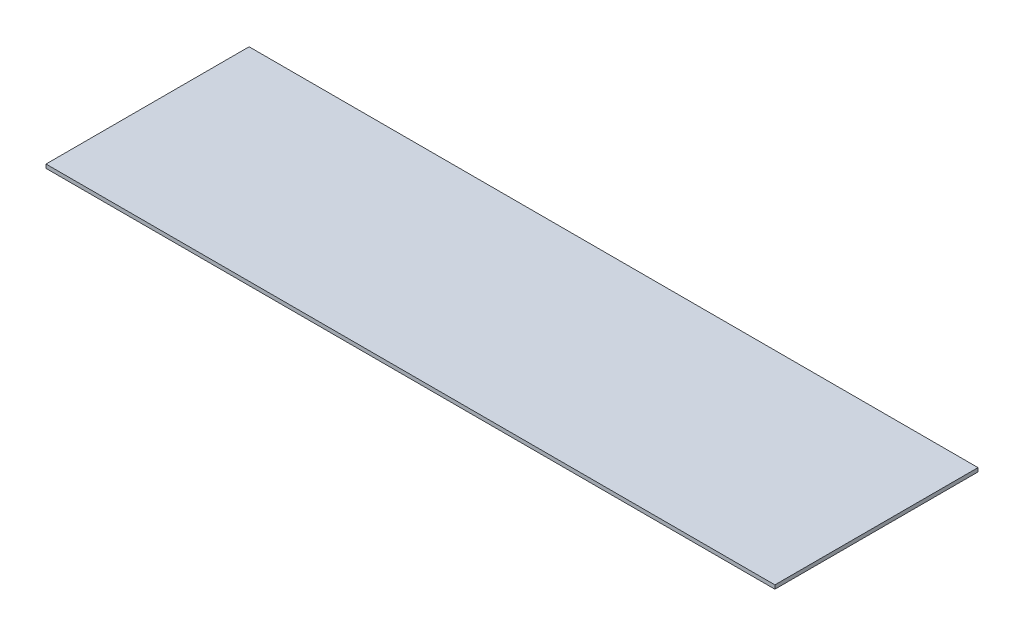
ISO-10303-21;
HEADER;
FILE_DESCRIPTION(('STEP AP214'),'2;1');
FILE_NAME('part.step','',(''),(''),'','','');
FILE_SCHEMA(('AUTOMOTIVE_DESIGN { 1 0 10303 214 1 1 1 1 }'));
ENDSEC;
DATA;
#1=APPLICATION_CONTEXT('core data for automotive mechanical design processes');
#2=APPLICATION_PROTOCOL_DEFINITION('international standard','automotive_design',2000,#1);
#3=PRODUCT_CONTEXT('',#1,'mechanical');
#4=PRODUCT('Part','Part','',(#3));
#5=PRODUCT_RELATED_PRODUCT_CATEGORY('part','',(#4));
#6=PRODUCT_DEFINITION_FORMATION('','',#4);
#7=PRODUCT_DEFINITION_CONTEXT('part definition',#1,'design');
#8=PRODUCT_DEFINITION('design','',#6,#7);
#9=PRODUCT_DEFINITION_SHAPE('','',#8);
#10=(LENGTH_UNIT() NAMED_UNIT(*) SI_UNIT(.MILLI.,.METRE.));
#11=(NAMED_UNIT(*) PLANE_ANGLE_UNIT() SI_UNIT($,.RADIAN.));
#12=(NAMED_UNIT(*) SI_UNIT($,.STERADIAN.) SOLID_ANGLE_UNIT());
#13=UNCERTAINTY_MEASURE_WITH_UNIT(LENGTH_MEASURE(1.E-05),#10,'distance_accuracy_value','');
#14=(GEOMETRIC_REPRESENTATION_CONTEXT(3) GLOBAL_UNCERTAINTY_ASSIGNED_CONTEXT((#13)) GLOBAL_UNIT_ASSIGNED_CONTEXT((#10,
#11,#12)) REPRESENTATION_CONTEXT('',''));
#15=CARTESIAN_POINT('',(0.,0.,0.));
#16=DIRECTION('',(0.,0.,1.));
#17=DIRECTION('',(1.,0.,0.));
#18=AXIS2_PLACEMENT_3D('',#15,#16,#17);
#19=CARTESIAN_POINT('',(1219.2,12.7,339.725));
#20=DIRECTION('',(-1.,0.,0.));
#21=DIRECTION('',(0.,0.,1.));
#22=AXIS2_PLACEMENT_3D('',#19,#20,#21);
#23=PLANE('',#22);
#24=DIRECTION('',(0.,0.,-1.));
#25=VECTOR('',#24,1.);
#26=CARTESIAN_POINT('',(1219.2,0.,339.725));
#27=LINE('',#26,#25);
#28=CARTESIAN_POINT('',(1219.2,0.,339.725));
#29=VERTEX_POINT('',#28);
#30=CARTESIAN_POINT('',(1219.2,0.,-339.725));
#31=VERTEX_POINT('',#30);
#32=EDGE_CURVE('E107',#29,#31,#27,.T.);
#33=ORIENTED_EDGE('',*,*,#32,.T.);
#34=DIRECTION('',(0.,-1.,0.));
#35=VECTOR('',#34,1.);
#36=CARTESIAN_POINT('',(1219.2,12.7,-339.725));
#37=LINE('',#36,#35);
#38=CARTESIAN_POINT('',(1219.2,12.7,-339.725));
#39=VERTEX_POINT('',#38);
#40=EDGE_CURVE('E11',#39,#31,#37,.T.);
#41=ORIENTED_EDGE('',*,*,#40,.F.);
#42=DIRECTION('',(0.,0.,-1.));
#43=VECTOR('',#42,1.);
#44=CARTESIAN_POINT('',(1219.2,12.7,339.725));
#45=LINE('',#44,#43);
#46=CARTESIAN_POINT('',(1219.2,12.7,339.725));
#47=VERTEX_POINT('',#46);
#48=EDGE_CURVE('E91',#47,#39,#45,.T.);
#49=ORIENTED_EDGE('',*,*,#48,.F.);
#50=DIRECTION('',(0.,-1.,0.));
#51=VECTOR('',#50,1.);
#52=CARTESIAN_POINT('',(1219.2,12.7,339.725));
#53=LINE('',#52,#51);
#54=EDGE_CURVE('E103',#47,#29,#53,.T.);
#55=ORIENTED_EDGE('',*,*,#54,.T.);
#56=EDGE_LOOP('',(#33,#41,#49,#55));
#57=FACE_BOUND('',#56,.T.);
#58=ADVANCED_FACE('F39',(#57),#23,.F.);
#59=CARTESIAN_POINT('',(-1219.2,12.7,-339.725));
#60=DIRECTION('',(0.,0.,1.));
#61=DIRECTION('',(1.,0.,0.));
#62=AXIS2_PLACEMENT_3D('',#59,#60,#61);
#63=PLANE('',#62);
#64=DIRECTION('',(-1.,0.,0.));
#65=VECTOR('',#64,1.);
#66=CARTESIAN_POINT('',(-1219.2,0.,-339.725));
#67=LINE('',#66,#65);
#68=CARTESIAN_POINT('',(-1219.2,0.,-339.725));
#69=VERTEX_POINT('',#68);
#70=EDGE_CURVE('E96',#31,#69,#67,.T.);
#71=ORIENTED_EDGE('',*,*,#70,.T.);
#72=DIRECTION('',(0.,-1.,0.));
#73=VECTOR('',#72,1.);
#74=CARTESIAN_POINT('',(-1219.2,12.7,-339.725));
#75=LINE('',#74,#73);
#76=CARTESIAN_POINT('',(-1219.2,12.7,-339.725));
#77=VERTEX_POINT('',#76);
#78=EDGE_CURVE('E48',#77,#69,#75,.T.);
#79=ORIENTED_EDGE('',*,*,#78,.F.);
#80=DIRECTION('',(-1.,0.,0.));
#81=VECTOR('',#80,1.);
#82=CARTESIAN_POINT('',(-1219.2,12.7,-339.725));
#83=LINE('',#82,#81);
#84=EDGE_CURVE('E86',#39,#77,#83,.T.);
#85=ORIENTED_EDGE('',*,*,#84,.F.);
#86=ORIENTED_EDGE('',*,*,#40,.T.);
#87=EDGE_LOOP('',(#71,#79,#85,#86));
#88=FACE_BOUND('',#87,.T.);
#89=ADVANCED_FACE('F95',(#88),#63,.F.);
#90=CARTESIAN_POINT('',(-1219.2,12.7,339.725));
#91=DIRECTION('',(1.,0.,0.));
#92=DIRECTION('',(0.,0.,-1.));
#93=AXIS2_PLACEMENT_3D('',#90,#91,#92);
#94=PLANE('',#93);
#95=DIRECTION('',(0.,0.,1.));
#96=VECTOR('',#95,1.);
#97=CARTESIAN_POINT('',(-1219.2,0.,339.725));
#98=LINE('',#97,#96);
#99=CARTESIAN_POINT('',(-1219.2,0.,339.725));
#100=VERTEX_POINT('',#99);
#101=EDGE_CURVE('E73',#69,#100,#98,.T.);
#102=ORIENTED_EDGE('',*,*,#101,.T.);
#103=DIRECTION('',(0.,-1.,0.));
#104=VECTOR('',#103,1.);
#105=CARTESIAN_POINT('',(-1219.2,12.7,339.725));
#106=LINE('',#105,#104);
#107=CARTESIAN_POINT('',(-1219.2,12.7,339.725));
#108=VERTEX_POINT('',#107);
#109=EDGE_CURVE('E98',#108,#100,#106,.T.);
#110=ORIENTED_EDGE('',*,*,#109,.F.);
#111=DIRECTION('',(0.,0.,1.));
#112=VECTOR('',#111,1.);
#113=CARTESIAN_POINT('',(-1219.2,12.7,339.725));
#114=LINE('',#113,#112);
#115=EDGE_CURVE('E89',#77,#108,#114,.T.);
#116=ORIENTED_EDGE('',*,*,#115,.F.);
#117=ORIENTED_EDGE('',*,*,#78,.T.);
#118=EDGE_LOOP('',(#102,#110,#116,#117));
#119=FACE_BOUND('',#118,.T.);
#120=ADVANCED_FACE('F99',(#119),#94,.F.);
#121=CARTESIAN_POINT('',(-1219.2,12.7,339.725));
#122=DIRECTION('',(0.,0.,-1.));
#123=DIRECTION('',(-1.,0.,0.));
#124=AXIS2_PLACEMENT_3D('',#121,#122,#123);
#125=PLANE('',#124);
#126=DIRECTION('',(1.,0.,0.));
#127=VECTOR('',#126,1.);
#128=CARTESIAN_POINT('',(-1219.2,0.,339.725));
#129=LINE('',#128,#127);
#130=EDGE_CURVE('E79',#100,#29,#129,.T.);
#131=ORIENTED_EDGE('',*,*,#130,.T.);
#132=ORIENTED_EDGE('',*,*,#54,.F.);
#133=DIRECTION('',(1.,0.,0.));
#134=VECTOR('',#133,1.);
#135=CARTESIAN_POINT('',(-1219.2,12.7,339.725));
#136=LINE('',#135,#134);
#137=EDGE_CURVE('E56',#108,#47,#136,.T.);
#138=ORIENTED_EDGE('',*,*,#137,.F.);
#139=ORIENTED_EDGE('',*,*,#109,.T.);
#140=EDGE_LOOP('',(#131,#132,#138,#139));
#141=FACE_BOUND('',#140,.T.);
#142=ADVANCED_FACE('F120',(#141),#125,.F.);
#143=CARTESIAN_POINT('',(0.,12.7,0.));
#144=DIRECTION('',(0.,-1.,0.));
#145=DIRECTION('',(0.,0.,-1.));
#146=AXIS2_PLACEMENT_3D('',#143,#144,#145);
#147=PLANE('',#146);
#148=ORIENTED_EDGE('',*,*,#48,.T.);
#149=ORIENTED_EDGE('',*,*,#84,.T.);
#150=ORIENTED_EDGE('',*,*,#115,.T.);
#151=ORIENTED_EDGE('',*,*,#137,.T.);
#152=EDGE_LOOP('',(#148,#149,#150,#151));
#153=FACE_BOUND('',#152,.T.);
#154=ADVANCED_FACE('F87',(#153),#147,.F.);
#155=CARTESIAN_POINT('',(0.,0.,0.));
#156=DIRECTION('',(0.,-1.,0.));
#157=DIRECTION('',(0.,0.,-1.));
#158=AXIS2_PLACEMENT_3D('',#155,#156,#157);
#159=PLANE('',#158);
#160=ORIENTED_EDGE('',*,*,#32,.F.);
#161=ORIENTED_EDGE('',*,*,#130,.F.);
#162=ORIENTED_EDGE('',*,*,#101,.F.);
#163=ORIENTED_EDGE('',*,*,#70,.F.);
#164=EDGE_LOOP('',(#160,#161,#162,#163));
#165=FACE_BOUND('',#164,.T.);
#166=ADVANCED_FACE('F123',(#165),#159,.T.);
#167=CLOSED_SHELL('',(#58,#89,#120,#142,#154,#166));
#168=MANIFOLD_SOLID_BREP('B2',#167);
#169=ADVANCED_BREP_SHAPE_REPRESENTATION('',(#18,#168),#14);
#170=SHAPE_DEFINITION_REPRESENTATION(#9,#169);
ENDSEC;
END-ISO-10303-21;
